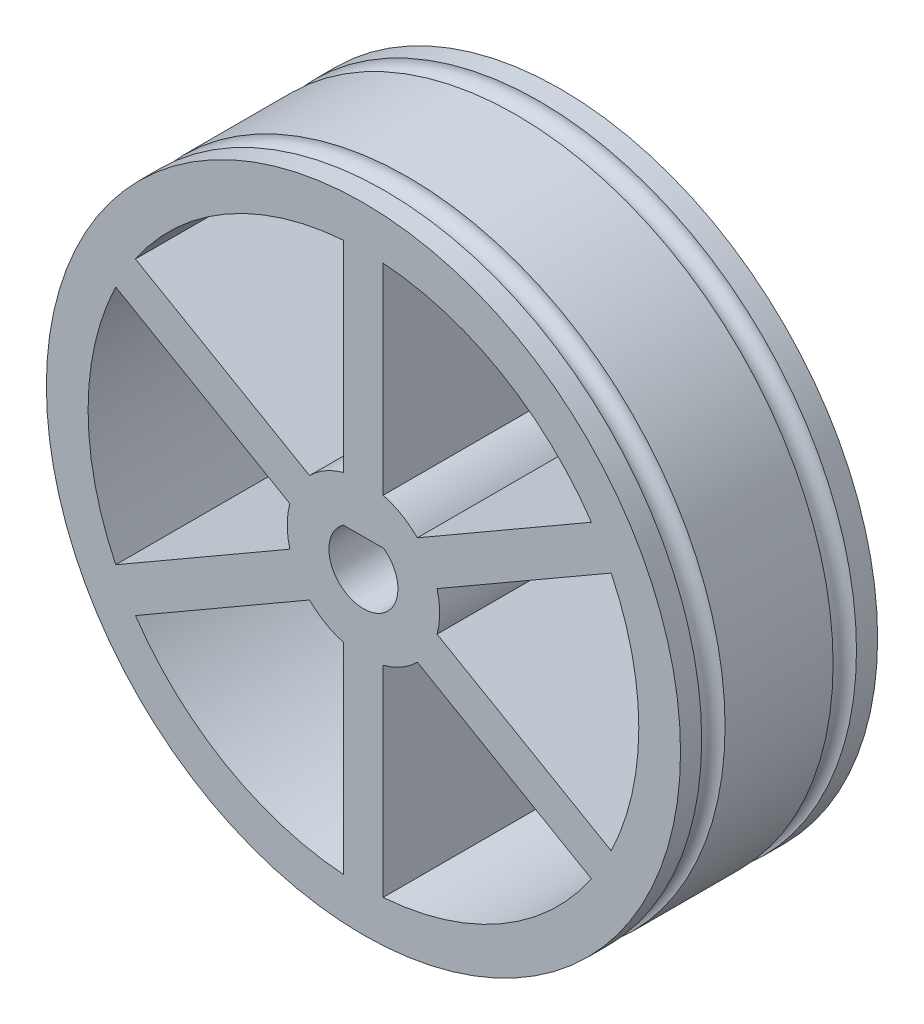
ISO-10303-21;
HEADER;
FILE_DESCRIPTION(('STEP AP214'),'2;1');
FILE_NAME('part.step','',(''),(''),'','','');
FILE_SCHEMA(('AUTOMOTIVE_DESIGN { 1 0 10303 214 1 1 1 1 }'));
ENDSEC;
DATA;
#1=APPLICATION_CONTEXT('core data for automotive mechanical design processes');
#2=APPLICATION_PROTOCOL_DEFINITION('international standard','automotive_design',2000,#1);
#3=PRODUCT_CONTEXT('',#1,'mechanical');
#4=PRODUCT('Part','Part','',(#3));
#5=PRODUCT_RELATED_PRODUCT_CATEGORY('part','',(#4));
#6=PRODUCT_DEFINITION_FORMATION('','',#4);
#7=PRODUCT_DEFINITION_CONTEXT('part definition',#1,'design');
#8=PRODUCT_DEFINITION('design','',#6,#7);
#9=PRODUCT_DEFINITION_SHAPE('','',#8);
#10=(LENGTH_UNIT() NAMED_UNIT(*) SI_UNIT(.MILLI.,.METRE.));
#11=(NAMED_UNIT(*) PLANE_ANGLE_UNIT() SI_UNIT($,.RADIAN.));
#12=(NAMED_UNIT(*) SI_UNIT($,.STERADIAN.) SOLID_ANGLE_UNIT());
#13=UNCERTAINTY_MEASURE_WITH_UNIT(LENGTH_MEASURE(1.E-05),#10,'distance_accuracy_value','');
#14=(GEOMETRIC_REPRESENTATION_CONTEXT(3) GLOBAL_UNCERTAINTY_ASSIGNED_CONTEXT((#13)) GLOBAL_UNIT_ASSIGNED_CONTEXT((#10,
#11,#12)) REPRESENTATION_CONTEXT('',''));
#15=CARTESIAN_POINT('',(0.,0.,0.));
#16=DIRECTION('',(0.,0.,1.));
#17=DIRECTION('',(1.,0.,0.));
#18=AXIS2_PLACEMENT_3D('',#15,#16,#17);
#19=CARTESIAN_POINT('',(0.,0.,15.));
#20=DIRECTION('',(0.,0.,-1.));
#21=DIRECTION('',(-1.,0.,0.));
#22=AXIS2_PLACEMENT_3D('',#19,#20,#21);
#23=CYLINDRICAL_SURFACE('',#22,24.13);
#24=CARTESIAN_POINT('',(0.,0.,1.61));
#25=DIRECTION('',(0.,0.,1.));
#26=DIRECTION('',(1.,0.,0.));
#27=AXIS2_PLACEMENT_3D('',#24,#25,#26);
#28=CIRCLE('',#27,24.13);
#29=CARTESIAN_POINT('',(24.13,0.,1.61));
#30=VERTEX_POINT('',#29);
#31=EDGE_CURVE('E318',#30,#30,#28,.F.);
#32=ORIENTED_EDGE('',*,*,#31,.T.);
#33=EDGE_LOOP('',(#32));
#34=FACE_BOUND('',#33,.T.);
#35=CARTESIAN_POINT('',(0.,0.,0.));
#36=DIRECTION('',(0.,0.,1.));
#37=DIRECTION('',(1.,0.,0.));
#38=AXIS2_PLACEMENT_3D('',#35,#36,#37);
#39=CIRCLE('',#38,24.13);
#40=CARTESIAN_POINT('',(24.13,0.,0.));
#41=VERTEX_POINT('',#40);
#42=EDGE_CURVE('E300',#41,#41,#39,.T.);
#43=ORIENTED_EDGE('',*,*,#42,.T.);
#44=EDGE_LOOP('',(#43));
#45=FACE_BOUND('',#44,.T.);
#46=ADVANCED_FACE('F49',(#34,#45),#23,.T.);
#47=CARTESIAN_POINT('',(0.,0.,15.));
#48=DIRECTION('',(0.,0.,-1.));
#49=DIRECTION('',(-1.,0.,0.));
#50=AXIS2_PLACEMENT_3D('',#47,#48,#49);
#51=CYLINDRICAL_SURFACE('',#50,20.955);
#52=DIRECTION('',(0.,0.,-1.));
#53=VECTOR('',#52,1.);
#54=CARTESIAN_POINT('',(17.3510087771371,11.7496603957608,15.));
#55=LINE('',#54,#53);
#56=CARTESIAN_POINT('',(17.3510087771371,11.7496603957608,15.));
#57=VERTEX_POINT('',#56);
#58=CARTESIAN_POINT('',(17.3510087771371,11.7496603957608,0.));
#59=VERTEX_POINT('',#58);
#60=EDGE_CURVE('E362',#57,#59,#55,.T.);
#61=ORIENTED_EDGE('',*,*,#60,.F.);
#62=CARTESIAN_POINT('',(0.,0.,15.));
#63=DIRECTION('',(0.,0.,1.));
#64=DIRECTION('',(1.,0.,0.));
#65=AXIS2_PLACEMENT_3D('',#62,#63,#64);
#66=CIRCLE('',#65,20.955);
#67=CARTESIAN_POINT('',(1.5,20.9012445801679,15.));
#68=VERTEX_POINT('',#67);
#69=EDGE_CURVE('E291',#57,#68,#66,.T.);
#70=ORIENTED_EDGE('',*,*,#69,.T.);
#71=DIRECTION('',(0.,0.,-1.));
#72=VECTOR('',#71,1.);
#73=CARTESIAN_POINT('',(1.5,20.9012445801679,15.));
#74=LINE('',#73,#72);
#75=CARTESIAN_POINT('',(1.5,20.9012445801679,0.));
#76=VERTEX_POINT('',#75);
#77=EDGE_CURVE('E275',#76,#68,#74,.F.);
#78=ORIENTED_EDGE('',*,*,#77,.F.);
#79=CARTESIAN_POINT('',(0.,0.,0.));
#80=DIRECTION('',(0.,0.,1.));
#81=DIRECTION('',(1.,0.,0.));
#82=AXIS2_PLACEMENT_3D('',#79,#80,#81);
#83=CIRCLE('',#82,20.955);
#84=EDGE_CURVE('E285',#59,#76,#83,.T.);
#85=ORIENTED_EDGE('',*,*,#84,.F.);
#86=EDGE_LOOP('',(#61,#70,#78,#85));
#87=FACE_BOUND('',#86,.T.);
#88=ADVANCED_FACE('F539',(#87),#51,.F.);
#89=CARTESIAN_POINT('',(0.,0.,15.));
#90=DIRECTION('',(0.,0.,-1.));
#91=DIRECTION('',(-1.,0.,0.));
#92=AXIS2_PLACEMENT_3D('',#89,#90,#91);
#93=CYLINDRICAL_SURFACE('',#92,5.8);
#94=CARTESIAN_POINT('',(0.,0.,15.));
#95=DIRECTION('',(0.,0.,1.));
#96=DIRECTION('',(1.,0.,0.));
#97=AXIS2_PLACEMENT_3D('',#94,#95,#96);
#98=CIRCLE('',#97,5.8);
#99=CARTESIAN_POINT('',(4.1020614175832,4.10037707124299,15.));
#100=VERTEX_POINT('',#99);
#101=CARTESIAN_POINT('',(1.5,5.60267793113258,15.));
#102=VERTEX_POINT('',#101);
#103=EDGE_CURVE('E477',#100,#102,#98,.T.);
#104=ORIENTED_EDGE('',*,*,#103,.F.);
#105=DIRECTION('',(0.,0.,-1.));
#106=VECTOR('',#105,1.);
#107=CARTESIAN_POINT('',(4.1020614175832,4.10037707124299,15.));
#108=LINE('',#107,#106);
#109=CARTESIAN_POINT('',(4.1020614175832,4.10037707124299,0.));
#110=VERTEX_POINT('',#109);
#111=EDGE_CURVE('E358',#100,#110,#108,.T.);
#112=ORIENTED_EDGE('',*,*,#111,.T.);
#113=CARTESIAN_POINT('',(0.,0.,0.));
#114=DIRECTION('',(0.,0.,1.));
#115=DIRECTION('',(1.,0.,0.));
#116=AXIS2_PLACEMENT_3D('',#113,#114,#115);
#117=CIRCLE('',#116,5.8);
#118=CARTESIAN_POINT('',(1.5,5.60267793113258,0.));
#119=VERTEX_POINT('',#118);
#120=EDGE_CURVE('E241',#110,#119,#117,.T.);
#121=ORIENTED_EDGE('',*,*,#120,.T.);
#122=DIRECTION('',(0.,0.,-1.));
#123=VECTOR('',#122,1.);
#124=CARTESIAN_POINT('',(1.5,5.60267793113258,15.));
#125=LINE('',#124,#123);
#126=EDGE_CURVE('E295',#102,#119,#125,.T.);
#127=ORIENTED_EDGE('',*,*,#126,.F.);
#128=EDGE_LOOP('',(#104,#112,#121,#127));
#129=FACE_BOUND('',#128,.T.);
#130=ADVANCED_FACE('F544',(#129),#93,.T.);
#131=DIRECTION('',(0.,0.,-1.));
#132=VECTOR('',#131,1.);
#133=CARTESIAN_POINT('',(18.8510087771372,9.15158418440754,15.));
#134=LINE('',#133,#132);
#135=CARTESIAN_POINT('',(18.8510087771372,9.15158418440754,0.));
#136=VERTEX_POINT('',#135);
#137=CARTESIAN_POINT('',(18.8510087771372,9.15158418440754,15.));
#138=VERTEX_POINT('',#137);
#139=EDGE_CURVE('E355',#136,#138,#134,.F.);
#140=ORIENTED_EDGE('',*,*,#139,.F.);
#141=CARTESIAN_POINT('',(18.8510087771373,-9.15158418440714,0.));
#142=VERTEX_POINT('',#141);
#143=EDGE_CURVE('E530',#142,#136,#83,.T.);
#144=ORIENTED_EDGE('',*,*,#143,.F.);
#145=DIRECTION('',(0.,0.,-1.));
#146=VECTOR('',#145,1.);
#147=CARTESIAN_POINT('',(18.8510087771373,-9.15158418440714,15.));
#148=LINE('',#147,#146);
#149=CARTESIAN_POINT('',(18.8510087771373,-9.15158418440714,15.));
#150=VERTEX_POINT('',#149);
#151=EDGE_CURVE('E393',#150,#142,#148,.T.);
#152=ORIENTED_EDGE('',*,*,#151,.F.);
#153=EDGE_CURVE('E549',#150,#138,#66,.T.);
#154=ORIENTED_EDGE('',*,*,#153,.T.);
#155=EDGE_LOOP('',(#140,#144,#152,#154));
#156=FACE_BOUND('',#155,.T.);
#157=ADVANCED_FACE('F590',(#156),#51,.F.);
#158=CARTESIAN_POINT('',(5.60206141758326,-1.50230085988958,0.));
#159=VERTEX_POINT('',#158);
#160=CARTESIAN_POINT('',(5.60206141758323,1.5023008598897,0.));
#161=VERTEX_POINT('',#160);
#162=EDGE_CURVE('E246',#159,#161,#117,.T.);
#163=ORIENTED_EDGE('',*,*,#162,.T.);
#164=DIRECTION('',(0.,0.,-1.));
#165=VECTOR('',#164,1.);
#166=CARTESIAN_POINT('',(5.60206141758323,1.5023008598897,15.));
#167=LINE('',#166,#165);
#168=CARTESIAN_POINT('',(5.60206141758323,1.5023008598897,15.));
#169=VERTEX_POINT('',#168);
#170=EDGE_CURVE('E349',#161,#169,#167,.F.);
#171=ORIENTED_EDGE('',*,*,#170,.T.);
#172=CARTESIAN_POINT('',(5.60206141758326,-1.50230085988958,15.));
#173=VERTEX_POINT('',#172);
#174=EDGE_CURVE('E479',#173,#169,#98,.T.);
#175=ORIENTED_EDGE('',*,*,#174,.F.);
#176=DIRECTION('',(0.,0.,-1.));
#177=VECTOR('',#176,1.);
#178=CARTESIAN_POINT('',(5.60206141758326,-1.50230085988958,15.));
#179=LINE('',#178,#177);
#180=EDGE_CURVE('E389',#173,#159,#179,.T.);
#181=ORIENTED_EDGE('',*,*,#180,.T.);
#182=EDGE_LOOP('',(#163,#171,#175,#181));
#183=FACE_BOUND('',#182,.T.);
#184=ADVANCED_FACE('F764',(#183),#93,.T.);
#185=DIRECTION('',(0.,0.,-1.));
#186=VECTOR('',#185,1.);
#187=CARTESIAN_POINT('',(17.3510087771374,-11.7496603957605,15.));
#188=LINE('',#187,#186);
#189=CARTESIAN_POINT('',(17.3510087771374,-11.7496603957605,0.));
#190=VERTEX_POINT('',#189);
#191=CARTESIAN_POINT('',(17.3510087771374,-11.7496603957605,15.));
#192=VERTEX_POINT('',#191);
#193=EDGE_CURVE('E385',#190,#192,#188,.F.);
#194=ORIENTED_EDGE('',*,*,#193,.F.);
#195=CARTESIAN_POINT('',(1.5,-20.9012445801679,0.));
#196=VERTEX_POINT('',#195);
#197=EDGE_CURVE('E526',#196,#190,#83,.T.);
#198=ORIENTED_EDGE('',*,*,#197,.F.);
#199=DIRECTION('',(0.,0.,-1.));
#200=VECTOR('',#199,1.);
#201=CARTESIAN_POINT('',(1.5,-20.9012445801679,15.));
#202=LINE('',#201,#200);
#203=CARTESIAN_POINT('',(1.5,-20.9012445801679,15.));
#204=VERTEX_POINT('',#203);
#205=EDGE_CURVE('E424',#204,#196,#202,.T.);
#206=ORIENTED_EDGE('',*,*,#205,.F.);
#207=EDGE_CURVE('E551',#204,#192,#66,.T.);
#208=ORIENTED_EDGE('',*,*,#207,.T.);
#209=EDGE_LOOP('',(#194,#198,#206,#208));
#210=FACE_BOUND('',#209,.T.);
#211=ADVANCED_FACE('F757',(#210),#51,.F.);
#212=CARTESIAN_POINT('',(1.5,-5.60267793113257,0.));
#213=VERTEX_POINT('',#212);
#214=CARTESIAN_POINT('',(4.10206141758329,-4.10037707124291,0.));
#215=VERTEX_POINT('',#214);
#216=EDGE_CURVE('E519',#213,#215,#117,.T.);
#217=ORIENTED_EDGE('',*,*,#216,.T.);
#218=DIRECTION('',(0.,0.,-1.));
#219=VECTOR('',#218,1.);
#220=CARTESIAN_POINT('',(4.10206141758329,-4.10037707124291,15.));
#221=LINE('',#220,#219);
#222=CARTESIAN_POINT('',(4.10206141758329,-4.10037707124291,15.));
#223=VERTEX_POINT('',#222);
#224=EDGE_CURVE('E378',#215,#223,#221,.F.);
#225=ORIENTED_EDGE('',*,*,#224,.T.);
#226=CARTESIAN_POINT('',(1.5,-5.60267793113257,15.));
#227=VERTEX_POINT('',#226);
#228=EDGE_CURVE('E487',#227,#223,#98,.T.);
#229=ORIENTED_EDGE('',*,*,#228,.F.);
#230=DIRECTION('',(0.,0.,-1.));
#231=VECTOR('',#230,1.);
#232=CARTESIAN_POINT('',(1.5,-5.60267793113258,15.));
#233=LINE('',#232,#231);
#234=EDGE_CURVE('E420',#227,#213,#233,.T.);
#235=ORIENTED_EDGE('',*,*,#234,.T.);
#236=EDGE_LOOP('',(#217,#225,#229,#235));
#237=FACE_BOUND('',#236,.T.);
#238=ADVANCED_FACE('F517',(#237),#93,.T.);
#239=DIRECTION('',(0.,0.,-1.));
#240=VECTOR('',#239,1.);
#241=CARTESIAN_POINT('',(-1.5,-20.9012445801679,15.));
#242=LINE('',#241,#240);
#243=CARTESIAN_POINT('',(-1.5,-20.9012445801679,0.));
#244=VERTEX_POINT('',#243);
#245=CARTESIAN_POINT('',(-1.5,-20.9012445801679,15.));
#246=VERTEX_POINT('',#245);
#247=EDGE_CURVE('E416',#244,#246,#242,.F.);
#248=ORIENTED_EDGE('',*,*,#247,.F.);
#249=CARTESIAN_POINT('',(-17.3510087771372,-11.7496603957607,0.));
#250=VERTEX_POINT('',#249);
#251=EDGE_CURVE('E529',#250,#244,#83,.T.);
#252=ORIENTED_EDGE('',*,*,#251,.F.);
#253=DIRECTION('',(0.,0.,-1.));
#254=VECTOR('',#253,1.);
#255=CARTESIAN_POINT('',(-17.3510087771372,-11.7496603957607,15.));
#256=LINE('',#255,#254);
#257=CARTESIAN_POINT('',(-17.3510087771372,-11.7496603957607,15.));
#258=VERTEX_POINT('',#257);
#259=EDGE_CURVE('E455',#258,#250,#256,.T.);
#260=ORIENTED_EDGE('',*,*,#259,.F.);
#261=EDGE_CURVE('E555',#258,#246,#66,.T.);
#262=ORIENTED_EDGE('',*,*,#261,.T.);
#263=EDGE_LOOP('',(#248,#252,#260,#262));
#264=FACE_BOUND('',#263,.T.);
#265=ADVANCED_FACE('F743',(#264),#51,.F.);
#266=CARTESIAN_POINT('',(-4.10206141758323,-4.10037707124296,0.));
#267=VERTEX_POINT('',#266);
#268=CARTESIAN_POINT('',(-1.5,-5.60267793113257,0.));
#269=VERTEX_POINT('',#268);
#270=EDGE_CURVE('E946',#267,#269,#117,.T.);
#271=ORIENTED_EDGE('',*,*,#270,.T.);
#272=DIRECTION('',(0.,0.,-1.));
#273=VECTOR('',#272,1.);
#274=CARTESIAN_POINT('',(-1.5,-5.60267793113258,15.));
#275=LINE('',#274,#273);
#276=CARTESIAN_POINT('',(-1.5,-5.60267793113258,15.));
#277=VERTEX_POINT('',#276);
#278=EDGE_CURVE('E409',#269,#277,#275,.F.);
#279=ORIENTED_EDGE('',*,*,#278,.T.);
#280=CARTESIAN_POINT('',(-4.10206141758323,-4.10037707124296,15.));
#281=VERTEX_POINT('',#280);
#282=EDGE_CURVE('E496',#281,#277,#98,.T.);
#283=ORIENTED_EDGE('',*,*,#282,.F.);
#284=DIRECTION('',(0.,0.,-1.));
#285=VECTOR('',#284,1.);
#286=CARTESIAN_POINT('',(-4.10206141758323,-4.10037707124297,15.));
#287=LINE('',#286,#285);
#288=EDGE_CURVE('E451',#281,#267,#287,.T.);
#289=ORIENTED_EDGE('',*,*,#288,.T.);
#290=EDGE_LOOP('',(#271,#279,#283,#289));
#291=FACE_BOUND('',#290,.T.);
#292=ADVANCED_FACE('F736',(#291),#93,.T.);
#293=DIRECTION('',(0.,0.,-1.));
#294=VECTOR('',#293,1.);
#295=CARTESIAN_POINT('',(-18.8510087771372,-9.1515841844074,15.));
#296=LINE('',#295,#294);
#297=CARTESIAN_POINT('',(-18.8510087771372,-9.1515841844074,0.));
#298=VERTEX_POINT('',#297);
#299=CARTESIAN_POINT('',(-18.8510087771372,-9.1515841844074,15.));
#300=VERTEX_POINT('',#299);
#301=EDGE_CURVE('E447',#298,#300,#296,.F.);
#302=ORIENTED_EDGE('',*,*,#301,.F.);
#303=CARTESIAN_POINT('',(-18.8510087771373,9.15158418440727,0.));
#304=VERTEX_POINT('',#303);
#305=EDGE_CURVE('E301',#304,#298,#83,.T.);
#306=ORIENTED_EDGE('',*,*,#305,.F.);
#307=DIRECTION('',(0.,0.,-1.));
#308=VECTOR('',#307,1.);
#309=CARTESIAN_POINT('',(-18.8510087771373,9.15158418440727,15.));
#310=LINE('',#309,#308);
#311=CARTESIAN_POINT('',(-18.8510087771373,9.15158418440727,15.));
#312=VERTEX_POINT('',#311);
#313=EDGE_CURVE('E242',#312,#304,#310,.T.);
#314=ORIENTED_EDGE('',*,*,#313,.F.);
#315=EDGE_CURVE('E290',#312,#300,#66,.T.);
#316=ORIENTED_EDGE('',*,*,#315,.T.);
#317=EDGE_LOOP('',(#302,#306,#314,#316));
#318=FACE_BOUND('',#317,.T.);
#319=ADVANCED_FACE('F562',(#318),#51,.F.);
#320=CARTESIAN_POINT('',(-5.60206141758326,1.50230085988962,0.));
#321=VERTEX_POINT('',#320);
#322=CARTESIAN_POINT('',(-5.60206141758324,-1.50230085988965,0.));
#323=VERTEX_POINT('',#322);
#324=EDGE_CURVE('E258',#321,#323,#117,.T.);
#325=ORIENTED_EDGE('',*,*,#324,.T.);
#326=DIRECTION('',(0.,0.,-1.));
#327=VECTOR('',#326,1.);
#328=CARTESIAN_POINT('',(-5.60206141758325,-1.50230085988965,15.));
#329=LINE('',#328,#327);
#330=CARTESIAN_POINT('',(-5.60206141758325,-1.50230085988965,15.));
#331=VERTEX_POINT('',#330);
#332=EDGE_CURVE('E440',#323,#331,#329,.F.);
#333=ORIENTED_EDGE('',*,*,#332,.T.);
#334=CARTESIAN_POINT('',(-5.60206141758326,1.50230085988962,15.));
#335=VERTEX_POINT('',#334);
#336=EDGE_CURVE('E490',#335,#331,#98,.T.);
#337=ORIENTED_EDGE('',*,*,#336,.F.);
#338=DIRECTION('',(0.,0.,-1.));
#339=VECTOR('',#338,1.);
#340=CARTESIAN_POINT('',(-5.60206141758326,1.50230085988962,15.));
#341=LINE('',#340,#339);
#342=EDGE_CURVE('E237',#335,#321,#341,.T.);
#343=ORIENTED_EDGE('',*,*,#342,.T.);
#344=EDGE_LOOP('',(#325,#333,#337,#343));
#345=FACE_BOUND('',#344,.T.);
#346=ADVANCED_FACE('F605',(#345),#93,.T.);
#347=CARTESIAN_POINT('',(-1.5,20.955,33.5738768166476));
#348=DIRECTION('',(-1.,0.,0.));
#349=DIRECTION('',(0.,0.,1.));
#350=AXIS2_PLACEMENT_3D('',#347,#348,#349);
#351=PLANE('',#350);
#352=DIRECTION('',(0.,1.,0.));
#353=VECTOR('',#352,1.);
#354=CARTESIAN_POINT('',(-1.5,20.955,0.));
#355=LINE('',#354,#353);
#356=CARTESIAN_POINT('',(-1.5,5.60267793113258,0.));
#357=VERTEX_POINT('',#356);
#358=CARTESIAN_POINT('',(-1.5,20.9012445801679,0.));
#359=VERTEX_POINT('',#358);
#360=EDGE_CURVE('E264',#357,#359,#355,.T.);
#361=ORIENTED_EDGE('',*,*,#360,.F.);
#362=DIRECTION('',(0.,0.,-1.));
#363=VECTOR('',#362,1.);
#364=CARTESIAN_POINT('',(-1.5,5.60267793113258,15.));
#365=LINE('',#364,#363);
#366=CARTESIAN_POINT('',(-1.5,5.60267793113258,15.));
#367=VERTEX_POINT('',#366);
#368=EDGE_CURVE('E259',#357,#367,#365,.F.);
#369=ORIENTED_EDGE('',*,*,#368,.T.);
#370=DIRECTION('',(0.,1.,0.));
#371=VECTOR('',#370,1.);
#372=CARTESIAN_POINT('',(-1.5,20.955,15.));
#373=LINE('',#372,#371);
#374=CARTESIAN_POINT('',(-1.5,20.9012445801679,15.));
#375=VERTEX_POINT('',#374);
#376=EDGE_CURVE('E267',#367,#375,#373,.T.);
#377=ORIENTED_EDGE('',*,*,#376,.T.);
#378=DIRECTION('',(0.,0.,-1.));
#379=VECTOR('',#378,1.);
#380=CARTESIAN_POINT('',(-1.5,20.9012445801679,15.));
#381=LINE('',#380,#379);
#382=EDGE_CURVE('E281',#375,#359,#381,.T.);
#383=ORIENTED_EDGE('',*,*,#382,.T.);
#384=EDGE_LOOP('',(#361,#369,#377,#383));
#385=FACE_BOUND('',#384,.T.);
#386=ADVANCED_FACE('F602',(#385),#351,.T.);
#387=CARTESIAN_POINT('',(1.5,20.955,33.5738768166476));
#388=DIRECTION('',(1.,0.,0.));
#389=DIRECTION('',(0.,0.,-1.));
#390=AXIS2_PLACEMENT_3D('',#387,#388,#389);
#391=PLANE('',#390);
#392=DIRECTION('',(0.,-1.,0.));
#393=VECTOR('',#392,1.);
#394=CARTESIAN_POINT('',(1.5,20.955,15.));
#395=LINE('',#394,#393);
#396=EDGE_CURVE('E271',#68,#102,#395,.T.);
#397=ORIENTED_EDGE('',*,*,#396,.T.);
#398=ORIENTED_EDGE('',*,*,#126,.T.);
#399=DIRECTION('',(0.,-1.,0.));
#400=VECTOR('',#399,1.);
#401=CARTESIAN_POINT('',(1.5,20.955,0.));
#402=LINE('',#401,#400);
#403=EDGE_CURVE('E263',#76,#119,#402,.T.);
#404=ORIENTED_EDGE('',*,*,#403,.F.);
#405=ORIENTED_EDGE('',*,*,#77,.T.);
#406=EDGE_LOOP('',(#397,#398,#404,#405));
#407=FACE_BOUND('',#406,.T.);
#408=ADVANCED_FACE('F542',(#407),#391,.T.);
#409=DIRECTION('',(0.,0.,-1.));
#410=VECTOR('',#409,1.);
#411=CARTESIAN_POINT('',(-17.3510087771373,11.7496603957606,15.));
#412=LINE('',#411,#410);
#413=CARTESIAN_POINT('',(-17.3510087771373,11.7496603957606,0.));
#414=VERTEX_POINT('',#413);
#415=CARTESIAN_POINT('',(-17.3510087771373,11.7496603957606,15.));
#416=VERTEX_POINT('',#415);
#417=EDGE_CURVE('E250',#414,#416,#412,.F.);
#418=ORIENTED_EDGE('',*,*,#417,.F.);
#419=EDGE_CURVE('E296',#359,#414,#83,.T.);
#420=ORIENTED_EDGE('',*,*,#419,.F.);
#421=ORIENTED_EDGE('',*,*,#382,.F.);
#422=EDGE_CURVE('E286',#375,#416,#66,.T.);
#423=ORIENTED_EDGE('',*,*,#422,.T.);
#424=EDGE_LOOP('',(#418,#420,#421,#423));
#425=FACE_BOUND('',#424,.T.);
#426=ADVANCED_FACE('F51',(#425),#51,.F.);
#427=CARTESIAN_POINT('',(0.,0.,13.39));
#428=DIRECTION('',(0.,0.,-1.));
#429=DIRECTION('',(-1.,0.,0.));
#430=AXIS2_PLACEMENT_3D('',#427,#428,#429);
#431=CIRCLE('',#430,24.13);
#432=CARTESIAN_POINT('',(-24.13,0.,13.39));
#433=VERTEX_POINT('',#432);
#434=EDGE_CURVE('E322',#433,#433,#431,.F.);
#435=ORIENTED_EDGE('',*,*,#434,.T.);
#436=EDGE_LOOP('',(#435));
#437=FACE_BOUND('',#436,.T.);
#438=CARTESIAN_POINT('',(0.,0.,15.));
#439=DIRECTION('',(0.,0.,1.));
#440=DIRECTION('',(1.,0.,0.));
#441=AXIS2_PLACEMENT_3D('',#438,#439,#440);
#442=CIRCLE('',#441,24.13);
#443=CARTESIAN_POINT('',(24.13,0.,15.));
#444=VERTEX_POINT('',#443);
#445=EDGE_CURVE('E289',#444,#444,#442,.T.);
#446=ORIENTED_EDGE('',*,*,#445,.F.);
#447=EDGE_LOOP('',(#446));
#448=FACE_BOUND('',#447,.T.);
#449=ADVANCED_FACE('F568',(#437,#448),#23,.T.);
#450=CARTESIAN_POINT('',(0.,0.,15.));
#451=DIRECTION('',(0.,0.,1.));
#452=DIRECTION('',(1.,0.,0.));
#453=AXIS2_PLACEMENT_3D('',#450,#451,#452);
#454=PLANE('',#453);
#455=CARTESIAN_POINT('',(0.,0.,15.));
#456=DIRECTION('',(0.,0.,1.));
#457=DIRECTION('',(1.,0.,0.));
#458=AXIS2_PLACEMENT_3D('',#455,#456,#457);
#459=CIRCLE('',#458,2.625);
#460=CARTESIAN_POINT('',(-1.54110350074224,2.125,15.));
#461=VERTEX_POINT('',#460);
#462=CARTESIAN_POINT('',(1.54110350074224,2.125,15.));
#463=VERTEX_POINT('',#462);
#464=EDGE_CURVE('E235',#461,#463,#459,.T.);
#465=ORIENTED_EDGE('',*,*,#464,.F.);
#466=DIRECTION('',(1.,0.,0.));
#467=VECTOR('',#466,1.);
#468=CARTESIAN_POINT('',(2.5,2.125,15.));
#469=LINE('',#468,#467);
#470=EDGE_CURVE('E228',#461,#463,#469,.T.);
#471=ORIENTED_EDGE('',*,*,#470,.T.);
#472=EDGE_LOOP('',(#465,#471));
#473=FACE_BOUND('',#472,.T.);
#474=ORIENTED_EDGE('',*,*,#69,.F.);
#475=DIRECTION('',(0.866025403784433,0.50000000000001,0.));
#476=VECTOR('',#475,1.);
#477=CARTESIAN_POINT('',(17.3975623363028,11.7765381056769,15.));
#478=LINE('',#477,#476);
#479=EDGE_CURVE('E343',#100,#57,#478,.T.);
#480=ORIENTED_EDGE('',*,*,#479,.F.);
#481=ORIENTED_EDGE('',*,*,#103,.T.);
#482=ORIENTED_EDGE('',*,*,#396,.F.);
#483=EDGE_LOOP('',(#474,#480,#481,#482));
#484=FACE_BOUND('',#483,.T.);
#485=DIRECTION('',(-0.866025403784433,-0.50000000000001,0.));
#486=VECTOR('',#485,1.);
#487=CARTESIAN_POINT('',(18.8975623363028,9.17846189432356,15.));
#488=LINE('',#487,#486);
#489=EDGE_CURVE('E71',#138,#169,#488,.T.);
#490=ORIENTED_EDGE('',*,*,#489,.F.);
#491=ORIENTED_EDGE('',*,*,#153,.F.);
#492=DIRECTION('',(0.866025403784443,-0.499999999999992,0.));
#493=VECTOR('',#492,1.);
#494=CARTESIAN_POINT('',(18.897562336303,-9.17846189432317,15.));
#495=LINE('',#494,#493);
#496=EDGE_CURVE('E371',#173,#150,#495,.T.);
#497=ORIENTED_EDGE('',*,*,#496,.F.);
#498=ORIENTED_EDGE('',*,*,#174,.T.);
#499=EDGE_LOOP('',(#490,#491,#497,#498));
#500=FACE_BOUND('',#499,.T.);
#501=DIRECTION('',(-0.866025403784443,0.499999999999992,0.));
#502=VECTOR('',#501,1.);
#503=CARTESIAN_POINT('',(17.397562336303,-11.7765381056765,15.));
#504=LINE('',#503,#502);
#505=EDGE_CURVE('E375',#192,#223,#504,.T.);
#506=ORIENTED_EDGE('',*,*,#505,.F.);
#507=ORIENTED_EDGE('',*,*,#207,.F.);
#508=DIRECTION('',(0.,-1.,0.));
#509=VECTOR('',#508,1.);
#510=CARTESIAN_POINT('',(1.5,-20.955,15.));
#511=LINE('',#510,#509);
#512=EDGE_CURVE('E402',#227,#204,#511,.T.);
#513=ORIENTED_EDGE('',*,*,#512,.F.);
#514=ORIENTED_EDGE('',*,*,#228,.T.);
#515=EDGE_LOOP('',(#506,#507,#513,#514));
#516=FACE_BOUND('',#515,.T.);
#517=DIRECTION('',(0.,1.,0.));
#518=VECTOR('',#517,1.);
#519=CARTESIAN_POINT('',(-1.5,-20.955,15.));
#520=LINE('',#519,#518);
#521=EDGE_CURVE('E406',#246,#277,#520,.T.);
#522=ORIENTED_EDGE('',*,*,#521,.F.);
#523=ORIENTED_EDGE('',*,*,#261,.F.);
#524=DIRECTION('',(-0.866025403784436,-0.500000000000004,0.));
#525=VECTOR('',#524,1.);
#526=CARTESIAN_POINT('',(-17.3975623363029,-11.7765381056767,15.));
#527=LINE('',#526,#525);
#528=EDGE_CURVE('E433',#281,#258,#527,.T.);
#529=ORIENTED_EDGE('',*,*,#528,.F.);
#530=ORIENTED_EDGE('',*,*,#282,.T.);
#531=EDGE_LOOP('',(#522,#523,#529,#530));
#532=FACE_BOUND('',#531,.T.);
#533=DIRECTION('',(0.866025403784436,0.500000000000004,0.));
#534=VECTOR('',#533,1.);
#535=CARTESIAN_POINT('',(-18.8975623363029,-9.17846189432343,15.));
#536=LINE('',#535,#534);
#537=EDGE_CURVE('E437',#300,#331,#536,.T.);
#538=ORIENTED_EDGE('',*,*,#537,.F.);
#539=ORIENTED_EDGE('',*,*,#315,.F.);
#540=DIRECTION('',(-0.86602540378444,0.499999999999998,0.));
#541=VECTOR('',#540,1.);
#542=CARTESIAN_POINT('',(-18.8975623363029,9.1784618943233,15.));
#543=LINE('',#542,#541);
#544=EDGE_CURVE('E464',#335,#312,#543,.T.);
#545=ORIENTED_EDGE('',*,*,#544,.F.);
#546=ORIENTED_EDGE('',*,*,#336,.T.);
#547=EDGE_LOOP('',(#538,#539,#545,#546));
#548=FACE_BOUND('',#547,.T.);
#549=DIRECTION('',(0.86602540378444,-0.499999999999998,0.));
#550=VECTOR('',#549,1.);
#551=CARTESIAN_POINT('',(-17.3975623363029,11.7765381056766,15.));
#552=LINE('',#551,#550);
#553=CARTESIAN_POINT('',(-4.10206141758326,4.10037707124294,15.));
#554=VERTEX_POINT('',#553);
#555=EDGE_CURVE('E468',#416,#554,#552,.T.);
#556=ORIENTED_EDGE('',*,*,#555,.F.);
#557=ORIENTED_EDGE('',*,*,#422,.F.);
#558=ORIENTED_EDGE('',*,*,#376,.F.);
#559=EDGE_CURVE('E253',#367,#554,#98,.T.);
#560=ORIENTED_EDGE('',*,*,#559,.T.);
#561=EDGE_LOOP('',(#556,#557,#558,#560));
#562=FACE_BOUND('',#561,.T.);
#563=ORIENTED_EDGE('',*,*,#445,.T.);
#564=EDGE_LOOP('',(#563));
#565=FACE_BOUND('',#564,.T.);
#566=ADVANCED_FACE('F513',(#473,#484,#500,#516,#532,#548,#562,#565),#454,.T.);
#567=CARTESIAN_POINT('',(0.,0.,0.));
#568=DIRECTION('',(0.,0.,1.));
#569=DIRECTION('',(1.,0.,0.));
#570=AXIS2_PLACEMENT_3D('',#567,#568,#569);
#571=PLANE('',#570);
#572=DIRECTION('',(-1.,0.,0.));
#573=VECTOR('',#572,1.);
#574=CARTESIAN_POINT('',(2.5,2.125,0.));
#575=LINE('',#574,#573);
#576=CARTESIAN_POINT('',(1.54110350074224,2.125,0.));
#577=VERTEX_POINT('',#576);
#578=CARTESIAN_POINT('',(-1.54110350074224,2.125,0.));
#579=VERTEX_POINT('',#578);
#580=EDGE_CURVE('E64',#577,#579,#575,.T.);
#581=ORIENTED_EDGE('',*,*,#580,.T.);
#582=CARTESIAN_POINT('',(0.,0.,0.));
#583=DIRECTION('',(0.,0.,1.));
#584=DIRECTION('',(1.,0.,0.));
#585=AXIS2_PLACEMENT_3D('',#582,#583,#584);
#586=CIRCLE('',#585,2.625);
#587=EDGE_CURVE('E233',#579,#577,#586,.T.);
#588=ORIENTED_EDGE('',*,*,#587,.T.);
#589=EDGE_LOOP('',(#581,#588));
#590=FACE_BOUND('',#589,.T.);
#591=DIRECTION('',(0.866025403784433,0.50000000000001,0.));
#592=VECTOR('',#591,1.);
#593=CARTESIAN_POINT('',(17.3975623363028,11.7765381056769,0.));
#594=LINE('',#593,#592);
#595=EDGE_CURVE('E334',#110,#59,#594,.T.);
#596=ORIENTED_EDGE('',*,*,#595,.T.);
#597=ORIENTED_EDGE('',*,*,#84,.T.);
#598=ORIENTED_EDGE('',*,*,#403,.T.);
#599=ORIENTED_EDGE('',*,*,#120,.F.);
#600=EDGE_LOOP('',(#596,#597,#598,#599));
#601=FACE_BOUND('',#600,.T.);
#602=ORIENTED_EDGE('',*,*,#143,.T.);
#603=DIRECTION('',(-0.866025403784433,-0.50000000000001,0.));
#604=VECTOR('',#603,1.);
#605=CARTESIAN_POINT('',(18.8975623363028,9.17846189432356,0.));
#606=LINE('',#605,#604);
#607=EDGE_CURVE('E329',#136,#161,#606,.T.);
#608=ORIENTED_EDGE('',*,*,#607,.T.);
#609=ORIENTED_EDGE('',*,*,#162,.F.);
#610=DIRECTION('',(0.866025403784443,-0.499999999999992,0.));
#611=VECTOR('',#610,1.);
#612=CARTESIAN_POINT('',(18.897562336303,-9.17846189432317,0.));
#613=LINE('',#612,#611);
#614=EDGE_CURVE('E367',#159,#142,#613,.T.);
#615=ORIENTED_EDGE('',*,*,#614,.T.);
#616=EDGE_LOOP('',(#602,#608,#609,#615));
#617=FACE_BOUND('',#616,.T.);
#618=ORIENTED_EDGE('',*,*,#197,.T.);
#619=DIRECTION('',(-0.866025403784443,0.499999999999992,0.));
#620=VECTOR('',#619,1.);
#621=CARTESIAN_POINT('',(17.397562336303,-11.7765381056765,0.));
#622=LINE('',#621,#620);
#623=EDGE_CURVE('E366',#190,#215,#622,.T.);
#624=ORIENTED_EDGE('',*,*,#623,.T.);
#625=ORIENTED_EDGE('',*,*,#216,.F.);
#626=DIRECTION('',(0.,-1.,0.));
#627=VECTOR('',#626,1.);
#628=CARTESIAN_POINT('',(1.5,-20.955,0.));
#629=LINE('',#628,#627);
#630=EDGE_CURVE('E398',#213,#196,#629,.T.);
#631=ORIENTED_EDGE('',*,*,#630,.T.);
#632=EDGE_LOOP('',(#618,#624,#625,#631));
#633=FACE_BOUND('',#632,.T.);
#634=ORIENTED_EDGE('',*,*,#251,.T.);
#635=DIRECTION('',(0.,1.,0.));
#636=VECTOR('',#635,1.);
#637=CARTESIAN_POINT('',(-1.5,-20.955,0.));
#638=LINE('',#637,#636);
#639=EDGE_CURVE('E397',#244,#269,#638,.T.);
#640=ORIENTED_EDGE('',*,*,#639,.T.);
#641=ORIENTED_EDGE('',*,*,#270,.F.);
#642=DIRECTION('',(-0.866025403784436,-0.500000000000004,0.));
#643=VECTOR('',#642,1.);
#644=CARTESIAN_POINT('',(-17.3975623363029,-11.7765381056767,0.));
#645=LINE('',#644,#643);
#646=EDGE_CURVE('E429',#267,#250,#645,.T.);
#647=ORIENTED_EDGE('',*,*,#646,.T.);
#648=EDGE_LOOP('',(#634,#640,#641,#647));
#649=FACE_BOUND('',#648,.T.);
#650=ORIENTED_EDGE('',*,*,#305,.T.);
#651=DIRECTION('',(0.866025403784436,0.500000000000004,0.));
#652=VECTOR('',#651,1.);
#653=CARTESIAN_POINT('',(-18.8975623363029,-9.17846189432343,0.));
#654=LINE('',#653,#652);
#655=EDGE_CURVE('E428',#298,#323,#654,.T.);
#656=ORIENTED_EDGE('',*,*,#655,.T.);
#657=ORIENTED_EDGE('',*,*,#324,.F.);
#658=DIRECTION('',(-0.86602540378444,0.499999999999998,0.));
#659=VECTOR('',#658,1.);
#660=CARTESIAN_POINT('',(-18.8975623363029,9.1784618943233,0.));
#661=LINE('',#660,#659);
#662=EDGE_CURVE('E460',#321,#304,#661,.T.);
#663=ORIENTED_EDGE('',*,*,#662,.T.);
#664=EDGE_LOOP('',(#650,#656,#657,#663));
#665=FACE_BOUND('',#664,.T.);
#666=ORIENTED_EDGE('',*,*,#419,.T.);
#667=DIRECTION('',(0.86602540378444,-0.499999999999998,0.));
#668=VECTOR('',#667,1.);
#669=CARTESIAN_POINT('',(-17.3975623363029,11.7765381056766,0.));
#670=LINE('',#669,#668);
#671=CARTESIAN_POINT('',(-4.10206141758326,4.10037707124294,0.));
#672=VERTEX_POINT('',#671);
#673=EDGE_CURVE('E459',#414,#672,#670,.T.);
#674=ORIENTED_EDGE('',*,*,#673,.T.);
#675=EDGE_CURVE('E248',#357,#672,#117,.T.);
#676=ORIENTED_EDGE('',*,*,#675,.F.);
#677=ORIENTED_EDGE('',*,*,#360,.T.);
#678=EDGE_LOOP('',(#666,#674,#676,#677));
#679=FACE_BOUND('',#678,.T.);
#680=ORIENTED_EDGE('',*,*,#42,.F.);
#681=EDGE_LOOP('',(#680));
#682=FACE_BOUND('',#681,.T.);
#683=ADVANCED_FACE('F238',(#590,#601,#617,#633,#649,#665,#679,#682),#571,.F.);
#684=CARTESIAN_POINT('',(0.,0.,15.));
#685=DIRECTION('',(0.,0.,-1.));
#686=DIRECTION('',(-1.,0.,0.));
#687=AXIS2_PLACEMENT_3D('',#684,#685,#686);
#688=CYLINDRICAL_SURFACE('',#687,2.625);
#689=DIRECTION('',(0.,0.,-1.));
#690=VECTOR('',#689,1.);
#691=CARTESIAN_POINT('',(-1.54110350074224,2.125,15.));
#692=LINE('',#691,#690);
#693=EDGE_CURVE('E12',#461,#579,#692,.T.);
#694=ORIENTED_EDGE('',*,*,#693,.F.);
#695=ORIENTED_EDGE('',*,*,#464,.T.);
#696=DIRECTION('',(0.,0.,-1.));
#697=VECTOR('',#696,1.);
#698=CARTESIAN_POINT('',(1.54110350074224,2.125,15.));
#699=LINE('',#698,#697);
#700=EDGE_CURVE('E58',#577,#463,#699,.F.);
#701=ORIENTED_EDGE('',*,*,#700,.F.);
#702=ORIENTED_EDGE('',*,*,#587,.F.);
#703=EDGE_LOOP('',(#694,#695,#701,#702));
#704=FACE_BOUND('',#703,.T.);
#705=ADVANCED_FACE('F232',(#704),#688,.F.);
#706=ORIENTED_EDGE('',*,*,#675,.T.);
#707=DIRECTION('',(0.,0.,-1.));
#708=VECTOR('',#707,1.);
#709=CARTESIAN_POINT('',(-4.10206141758326,4.10037707124294,15.));
#710=LINE('',#709,#708);
#711=EDGE_CURVE('E308',#672,#554,#710,.F.);
#712=ORIENTED_EDGE('',*,*,#711,.T.);
#713=ORIENTED_EDGE('',*,*,#559,.F.);
#714=ORIENTED_EDGE('',*,*,#368,.F.);
#715=EDGE_LOOP('',(#706,#712,#713,#714));
#716=FACE_BOUND('',#715,.T.);
#717=ADVANCED_FACE('F599',(#716),#93,.T.);
#718=CARTESIAN_POINT('',(-18.8975623363029,9.1784618943233,35.9817628884756));
#719=DIRECTION('',(-0.499999999999998,-0.86602540378444,0.));
#720=DIRECTION('',(0.86602540378444,-0.499999999999998,0.));
#721=AXIS2_PLACEMENT_3D('',#718,#719,#720);
#722=PLANE('',#721);
#723=ORIENTED_EDGE('',*,*,#544,.T.);
#724=ORIENTED_EDGE('',*,*,#313,.T.);
#725=ORIENTED_EDGE('',*,*,#662,.F.);
#726=ORIENTED_EDGE('',*,*,#342,.F.);
#727=EDGE_LOOP('',(#723,#724,#725,#726));
#728=FACE_BOUND('',#727,.T.);
#729=ADVANCED_FACE('F611',(#728),#722,.T.);
#730=CARTESIAN_POINT('',(-17.3975623363029,11.7765381056766,35.9817628884756));
#731=DIRECTION('',(0.499999999999998,0.86602540378444,0.));
#732=DIRECTION('',(-0.86602540378444,0.499999999999998,0.));
#733=AXIS2_PLACEMENT_3D('',#730,#731,#732);
#734=PLANE('',#733);
#735=ORIENTED_EDGE('',*,*,#673,.F.);
#736=ORIENTED_EDGE('',*,*,#417,.T.);
#737=ORIENTED_EDGE('',*,*,#555,.T.);
#738=ORIENTED_EDGE('',*,*,#711,.F.);
#739=EDGE_LOOP('',(#735,#736,#737,#738));
#740=FACE_BOUND('',#739,.T.);
#741=ADVANCED_FACE('F615',(#740),#734,.T.);
#742=CARTESIAN_POINT('',(-17.3975623363029,-11.7765381056767,35.9817628884756));
#743=DIRECTION('',(0.500000000000004,-0.866025403784436,0.));
#744=DIRECTION('',(0.866025403784436,0.500000000000004,0.));
#745=AXIS2_PLACEMENT_3D('',#742,#743,#744);
#746=PLANE('',#745);
#747=ORIENTED_EDGE('',*,*,#528,.T.);
#748=ORIENTED_EDGE('',*,*,#259,.T.);
#749=ORIENTED_EDGE('',*,*,#646,.F.);
#750=ORIENTED_EDGE('',*,*,#288,.F.);
#751=EDGE_LOOP('',(#747,#748,#749,#750));
#752=FACE_BOUND('',#751,.T.);
#753=ADVANCED_FACE('F619',(#752),#746,.T.);
#754=CARTESIAN_POINT('',(-18.8975623363029,-9.17846189432343,35.9817628884756));
#755=DIRECTION('',(-0.500000000000004,0.866025403784436,0.));
#756=DIRECTION('',(-0.866025403784436,-0.500000000000004,0.));
#757=AXIS2_PLACEMENT_3D('',#754,#755,#756);
#758=PLANE('',#757);
#759=ORIENTED_EDGE('',*,*,#655,.F.);
#760=ORIENTED_EDGE('',*,*,#301,.T.);
#761=ORIENTED_EDGE('',*,*,#537,.T.);
#762=ORIENTED_EDGE('',*,*,#332,.F.);
#763=EDGE_LOOP('',(#759,#760,#761,#762));
#764=FACE_BOUND('',#763,.T.);
#765=ADVANCED_FACE('F566',(#764),#758,.T.);
#766=CARTESIAN_POINT('',(1.5,-20.955,33.5738768166476));
#767=DIRECTION('',(1.,0.,0.));
#768=DIRECTION('',(0.,0.,-1.));
#769=AXIS2_PLACEMENT_3D('',#766,#767,#768);
#770=PLANE('',#769);
#771=ORIENTED_EDGE('',*,*,#512,.T.);
#772=ORIENTED_EDGE('',*,*,#205,.T.);
#773=ORIENTED_EDGE('',*,*,#630,.F.);
#774=ORIENTED_EDGE('',*,*,#234,.F.);
#775=EDGE_LOOP('',(#771,#772,#773,#774));
#776=FACE_BOUND('',#775,.T.);
#777=ADVANCED_FACE('F626',(#776),#770,.T.);
#778=CARTESIAN_POINT('',(-1.5,-20.955,33.5738768166476));
#779=DIRECTION('',(-1.,0.,0.));
#780=DIRECTION('',(0.,0.,1.));
#781=AXIS2_PLACEMENT_3D('',#778,#779,#780);
#782=PLANE('',#781);
#783=ORIENTED_EDGE('',*,*,#639,.F.);
#784=ORIENTED_EDGE('',*,*,#247,.T.);
#785=ORIENTED_EDGE('',*,*,#521,.T.);
#786=ORIENTED_EDGE('',*,*,#278,.F.);
#787=EDGE_LOOP('',(#783,#784,#785,#786));
#788=FACE_BOUND('',#787,.T.);
#789=ADVANCED_FACE('F629',(#788),#782,.T.);
#790=CARTESIAN_POINT('',(18.897562336303,-9.17846189432317,35.9817628884756));
#791=DIRECTION('',(0.499999999999992,0.866025403784443,0.));
#792=DIRECTION('',(-0.866025403784443,0.499999999999992,0.));
#793=AXIS2_PLACEMENT_3D('',#790,#791,#792);
#794=PLANE('',#793);
#795=ORIENTED_EDGE('',*,*,#496,.T.);
#796=ORIENTED_EDGE('',*,*,#151,.T.);
#797=ORIENTED_EDGE('',*,*,#614,.F.);
#798=ORIENTED_EDGE('',*,*,#180,.F.);
#799=EDGE_LOOP('',(#795,#796,#797,#798));
#800=FACE_BOUND('',#799,.T.);
#801=ADVANCED_FACE('F633',(#800),#794,.T.);
#802=CARTESIAN_POINT('',(17.397562336303,-11.7765381056765,35.9817628884756));
#803=DIRECTION('',(-0.499999999999992,-0.866025403784443,0.));
#804=DIRECTION('',(0.866025403784443,-0.499999999999992,0.));
#805=AXIS2_PLACEMENT_3D('',#802,#803,#804);
#806=PLANE('',#805);
#807=ORIENTED_EDGE('',*,*,#623,.F.);
#808=ORIENTED_EDGE('',*,*,#193,.T.);
#809=ORIENTED_EDGE('',*,*,#505,.T.);
#810=ORIENTED_EDGE('',*,*,#224,.F.);
#811=EDGE_LOOP('',(#807,#808,#809,#810));
#812=FACE_BOUND('',#811,.T.);
#813=ADVANCED_FACE('F522',(#812),#806,.T.);
#814=CARTESIAN_POINT('',(17.3975623363028,11.7765381056769,35.9817628884756));
#815=DIRECTION('',(-0.50000000000001,0.866025403784433,0.));
#816=DIRECTION('',(-0.866025403784433,-0.50000000000001,0.));
#817=AXIS2_PLACEMENT_3D('',#814,#815,#816);
#818=PLANE('',#817);
#819=ORIENTED_EDGE('',*,*,#479,.T.);
#820=ORIENTED_EDGE('',*,*,#60,.T.);
#821=ORIENTED_EDGE('',*,*,#595,.F.);
#822=ORIENTED_EDGE('',*,*,#111,.F.);
#823=EDGE_LOOP('',(#819,#820,#821,#822));
#824=FACE_BOUND('',#823,.T.);
#825=ADVANCED_FACE('F546',(#824),#818,.T.);
#826=CARTESIAN_POINT('',(18.8975623363028,9.17846189432356,35.9817628884756));
#827=DIRECTION('',(0.50000000000001,-0.866025403784433,0.));
#828=DIRECTION('',(0.866025403784433,0.50000000000001,0.));
#829=AXIS2_PLACEMENT_3D('',#826,#827,#828);
#830=PLANE('',#829);
#831=ORIENTED_EDGE('',*,*,#607,.F.);
#832=ORIENTED_EDGE('',*,*,#139,.T.);
#833=ORIENTED_EDGE('',*,*,#489,.T.);
#834=ORIENTED_EDGE('',*,*,#170,.F.);
#835=EDGE_LOOP('',(#831,#832,#833,#834));
#836=FACE_BOUND('',#835,.T.);
#837=ADVANCED_FACE('F642',(#836),#830,.T.);
#838=CARTESIAN_POINT('',(0.,0.,2.5));
#839=DIRECTION('',(0.,0.,-1.));
#840=DIRECTION('',(-1.,0.,0.));
#841=AXIS2_PLACEMENT_3D('',#838,#839,#840);
#842=TOROIDAL_SURFACE('',#841,24.13,0.89);
#843=CARTESIAN_POINT('',(0.,0.,3.39));
#844=DIRECTION('',(0.,0.,-1.));
#845=DIRECTION('',(-1.,0.,0.));
#846=AXIS2_PLACEMENT_3D('',#843,#844,#845);
#847=CIRCLE('',#846,24.13);
#848=CARTESIAN_POINT('',(-24.13,0.,3.39));
#849=VERTEX_POINT('',#848);
#850=EDGE_CURVE('E227',#849,#849,#847,.F.);
#851=ORIENTED_EDGE('',*,*,#850,.F.);
#852=EDGE_LOOP('',(#851));
#853=FACE_BOUND('',#852,.T.);
#854=ORIENTED_EDGE('',*,*,#31,.F.);
#855=EDGE_LOOP('',(#854));
#856=FACE_BOUND('',#855,.T.);
#857=ADVANCED_FACE('F645',(#853,#856),#842,.F.);
#858=CARTESIAN_POINT('',(0.,0.,12.5));
#859=DIRECTION('',(0.,0.,-1.));
#860=DIRECTION('',(-1.,0.,0.));
#861=AXIS2_PLACEMENT_3D('',#858,#859,#860);
#862=TOROIDAL_SURFACE('',#861,24.13,0.89);
#863=ORIENTED_EDGE('',*,*,#434,.F.);
#864=EDGE_LOOP('',(#863));
#865=FACE_BOUND('',#864,.T.);
#866=CARTESIAN_POINT('',(0.,0.,11.61));
#867=DIRECTION('',(0.,0.,1.));
#868=DIRECTION('',(1.,0.,0.));
#869=AXIS2_PLACEMENT_3D('',#866,#867,#868);
#870=CIRCLE('',#869,24.13);
#871=CARTESIAN_POINT('',(24.13,0.,11.61));
#872=VERTEX_POINT('',#871);
#873=EDGE_CURVE('E326',#872,#872,#870,.F.);
#874=ORIENTED_EDGE('',*,*,#873,.F.);
#875=EDGE_LOOP('',(#874));
#876=FACE_BOUND('',#875,.T.);
#877=ADVANCED_FACE('F584',(#865,#876),#862,.F.);
#878=ORIENTED_EDGE('',*,*,#873,.T.);
#879=EDGE_LOOP('',(#878));
#880=FACE_BOUND('',#879,.T.);
#881=ORIENTED_EDGE('',*,*,#850,.T.);
#882=EDGE_LOOP('',(#881));
#883=FACE_BOUND('',#882,.T.);
#884=ADVANCED_FACE('F577',(#880,#883),#23,.T.);
#885=CARTESIAN_POINT('',(2.5,2.125,-5.02493781056044));
#886=DIRECTION('',(0.,-1.,0.));
#887=DIRECTION('',(1.,0.,0.));
#888=AXIS2_PLACEMENT_3D('',#885,#886,#887);
#889=PLANE('',#888);
#890=ORIENTED_EDGE('',*,*,#470,.F.);
#891=ORIENTED_EDGE('',*,*,#693,.T.);
#892=ORIENTED_EDGE('',*,*,#580,.F.);
#893=ORIENTED_EDGE('',*,*,#700,.T.);
#894=EDGE_LOOP('',(#890,#891,#892,#893));
#895=FACE_BOUND('',#894,.T.);
#896=ADVANCED_FACE('F222',(#895),#889,.T.);
#897=CLOSED_SHELL('',(#46,#88,#130,#157,#184,#211,#238,#265,#292,#319,#346,#386,#408,#426,#449,
#566,#683,#705,#717,#729,#741,#753,#765,#777,#789,#801,#813,#825,#837,#857,#877,#884,#896));
#898=MANIFOLD_SOLID_BREP('B2',#897);
#899=ADVANCED_BREP_SHAPE_REPRESENTATION('',(#18,#898),#14);
#900=SHAPE_DEFINITION_REPRESENTATION(#9,#899);
ENDSEC;
END-ISO-10303-21;
